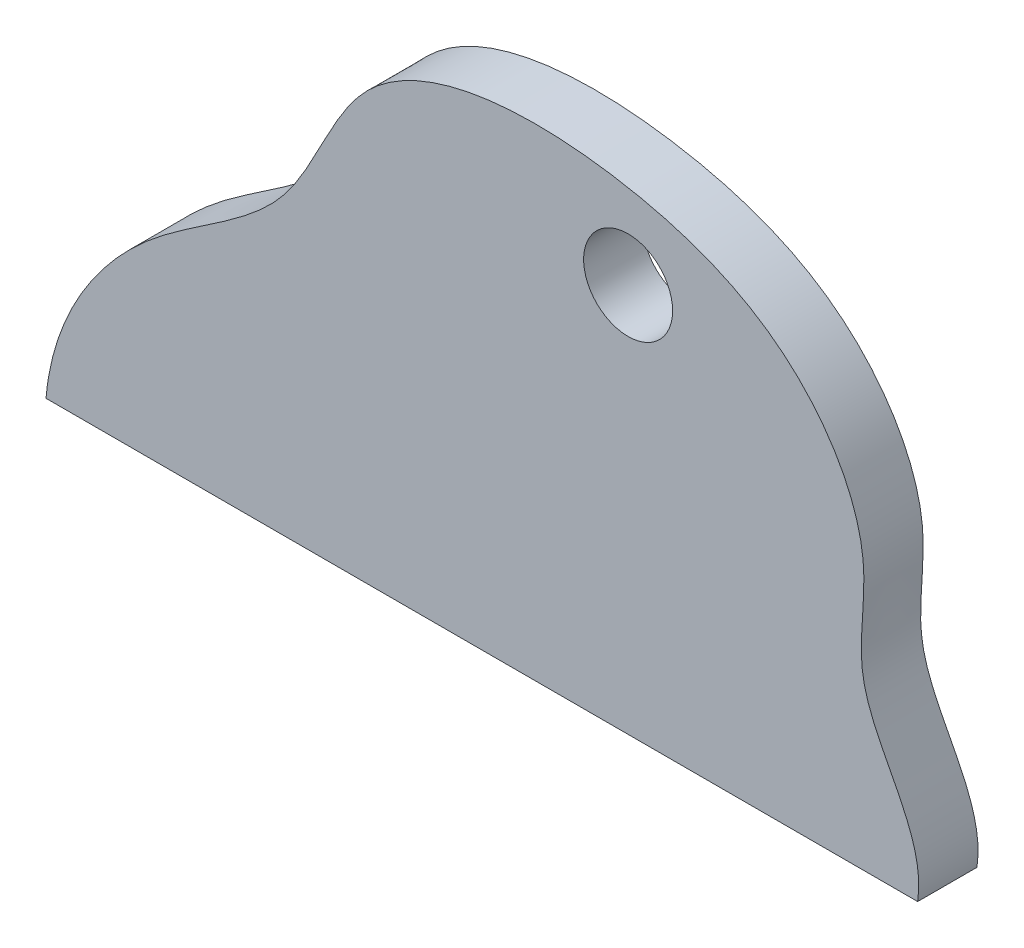
ISO-10303-21;
HEADER;
FILE_DESCRIPTION(('STEP AP214'),'2;1');
FILE_NAME('part.step','',(''),(''),'','','');
FILE_SCHEMA(('AUTOMOTIVE_DESIGN { 1 0 10303 214 1 1 1 1 }'));
ENDSEC;
DATA;
#1=APPLICATION_CONTEXT('core data for automotive mechanical design processes');
#2=APPLICATION_PROTOCOL_DEFINITION('international standard','automotive_design',2000,#1);
#3=PRODUCT_CONTEXT('',#1,'mechanical');
#4=PRODUCT('Part','Part','',(#3));
#5=PRODUCT_RELATED_PRODUCT_CATEGORY('part','',(#4));
#6=PRODUCT_DEFINITION_FORMATION('','',#4);
#7=PRODUCT_DEFINITION_CONTEXT('part definition',#1,'design');
#8=PRODUCT_DEFINITION('design','',#6,#7);
#9=PRODUCT_DEFINITION_SHAPE('','',#8);
#10=(LENGTH_UNIT() NAMED_UNIT(*) SI_UNIT(.MILLI.,.METRE.));
#11=(NAMED_UNIT(*) PLANE_ANGLE_UNIT() SI_UNIT($,.RADIAN.));
#12=(NAMED_UNIT(*) SI_UNIT($,.STERADIAN.) SOLID_ANGLE_UNIT());
#13=UNCERTAINTY_MEASURE_WITH_UNIT(LENGTH_MEASURE(1.E-05),#10,'distance_accuracy_value','');
#14=(GEOMETRIC_REPRESENTATION_CONTEXT(3) GLOBAL_UNCERTAINTY_ASSIGNED_CONTEXT((#13)) GLOBAL_UNIT_ASSIGNED_CONTEXT((#10,
#11,#12)) REPRESENTATION_CONTEXT('',''));
#15=CARTESIAN_POINT('',(0.,0.,0.));
#16=DIRECTION('',(0.,0.,1.));
#17=DIRECTION('',(1.,0.,0.));
#18=AXIS2_PLACEMENT_3D('',#15,#16,#17);
#19=CARTESIAN_POINT('',(448.777806783927,58.388253682406,3.73350148502297));
#20=DIRECTION('',(0.,0.,1.));
#21=DIRECTION('',(1.,0.,0.));
#22=AXIS2_PLACEMENT_3D('',#19,#20,#21);
#23=PLANE('',#22);
#24=CARTESIAN_POINT('',(454.750929555263,53.415813648006,3.73350148502297));
#25=DIRECTION('',(0.,0.,1.));
#26=DIRECTION('',(1.,0.,0.));
#27=AXIS2_PLACEMENT_3D('',#24,#25,#26);
#28=CIRCLE('',#27,2.38125);
#29=CARTESIAN_POINT('',(457.132179555263,53.415813648006,3.73350148502297));
#30=VERTEX_POINT('',#29);
#31=EDGE_CURVE('E75',#30,#30,#28,.T.);
#32=ORIENTED_EDGE('',*,*,#31,.F.);
#33=EDGE_LOOP('',(#32));
#34=FACE_BOUND('',#33,.T.);
#35=CARTESIAN_POINT('',(470.251737266378,32.5866032861945,3.73350148502297));
#36=CARTESIAN_POINT('',(470.750883981836,35.9022041792691,3.73350148502297));
#37=CARTESIAN_POINT('',(466.253912236021,39.9371943128726,3.73350148502297));
#38=CARTESIAN_POINT('',(468.102198779636,47.5502844614912,3.73350148502297));
#39=CARTESIAN_POINT('',(463.984519322268,54.9871581452452,3.73350148502297));
#40=CARTESIAN_POINT('',(453.915067328337,59.0936322057848,3.73350148502297));
#41=CARTESIAN_POINT('',(440.359759995239,58.4584966180975,3.73350148502297));
#42=CARTESIAN_POINT('',(437.047298305273,47.3163135006459,3.73350148502297));
#43=CARTESIAN_POINT('',(427.8943832988,43.0056334636702,3.73350148502297));
#44=CARTESIAN_POINT('',(423.949662501625,36.6974160406366,3.73350148502297));
#45=CARTESIAN_POINT('',(423.587847386041,32.5866032861945,3.73350148502297));
#46=B_SPLINE_CURVE_WITH_KNOTS('',3,(#35,#36,#37,#38,#39,#40,#41,#42,#43,#44,#45),.UNSPECIFIED.,
.F.,.F.,(4,1,1,1,1,1,1,1,4),(0.,0.123490607000142,0.193733585487914,0.290834879771525,
0.427925692940669,0.618703504281154,0.723847358274503,0.84053133361642,1.),.UNSPECIFIED.);
#47=CARTESIAN_POINT('',(470.251737266378,32.5866032861945,3.73350148502297));
#48=VERTEX_POINT('',#47);
#49=CARTESIAN_POINT('',(423.587847386041,32.5866032861945,3.73350148502297));
#50=VERTEX_POINT('',#49);
#51=EDGE_CURVE('E67',#48,#50,#46,.T.);
#52=ORIENTED_EDGE('',*,*,#51,.T.);
#53=DIRECTION('',(1.,0.,0.));
#54=VECTOR('',#53,1.);
#55=CARTESIAN_POINT('',(423.587847386041,32.5866032861945,3.73350148502297));
#56=LINE('',#55,#54);
#57=EDGE_CURVE('E52',#50,#48,#56,.T.);
#58=ORIENTED_EDGE('',*,*,#57,.T.);
#59=EDGE_LOOP('',(#52,#58));
#60=FACE_BOUND('',#59,.T.);
#61=ADVANCED_FACE('F35',(#34,#60),#23,.T.);
#62=CARTESIAN_POINT('',(448.777806783927,58.388253682406,0.558501485380882));
#63=DIRECTION('',(0.,0.,1.));
#64=DIRECTION('',(1.,0.,0.));
#65=AXIS2_PLACEMENT_3D('',#62,#63,#64);
#66=PLANE('',#65);
#67=CARTESIAN_POINT('',(454.750929555263,53.415813648006,0.558501485380882));
#68=DIRECTION('',(0.,0.,1.));
#69=DIRECTION('',(1.,0.,0.));
#70=AXIS2_PLACEMENT_3D('',#67,#68,#69);
#71=CIRCLE('',#70,2.38125);
#72=CARTESIAN_POINT('',(457.132179555263,53.415813648006,0.558501485380882));
#73=VERTEX_POINT('',#72);
#74=EDGE_CURVE('E72',#73,#73,#71,.T.);
#75=ORIENTED_EDGE('',*,*,#74,.T.);
#76=EDGE_LOOP('',(#75));
#77=FACE_BOUND('',#76,.T.);
#78=CARTESIAN_POINT('',(470.251737266378,32.5866032861945,0.558501485380882));
#79=CARTESIAN_POINT('',(470.750883981836,35.9022041792691,0.558501485380882));
#80=CARTESIAN_POINT('',(466.253912236021,39.9371943128726,0.558501485380882));
#81=CARTESIAN_POINT('',(468.102198779636,47.5502844614912,0.558501485380882));
#82=CARTESIAN_POINT('',(463.984519322268,54.9871581452452,0.558501485380882));
#83=CARTESIAN_POINT('',(453.915067328337,59.0936322057848,0.558501485380882));
#84=CARTESIAN_POINT('',(440.359759995239,58.4584966180975,0.558501485380882));
#85=CARTESIAN_POINT('',(437.047298305273,47.3163135006459,0.558501485380882));
#86=CARTESIAN_POINT('',(427.8943832988,43.0056334636702,0.558501485380882));
#87=CARTESIAN_POINT('',(423.949662501625,36.6974160406366,0.558501485380882));
#88=CARTESIAN_POINT('',(423.587847386041,32.5866032861945,0.558501485380882));
#89=B_SPLINE_CURVE_WITH_KNOTS('',3,(#78,#79,#80,#81,#82,#83,#84,#85,#86,#87,#88),.UNSPECIFIED.,
.F.,.F.,(4,1,1,1,1,1,1,1,4),(0.,0.123490607000142,0.193733585487914,0.290834879771525,
0.427925692940669,0.618703504281154,0.723847358274503,0.84053133361642,1.),.UNSPECIFIED.);
#90=CARTESIAN_POINT('',(470.251737266378,32.5866032861945,0.558501485380882));
#91=VERTEX_POINT('',#90);
#92=CARTESIAN_POINT('',(423.587847386041,32.5866032861945,0.558501485380882));
#93=VERTEX_POINT('',#92);
#94=EDGE_CURVE('E68',#91,#93,#89,.T.);
#95=ORIENTED_EDGE('',*,*,#94,.F.);
#96=DIRECTION('',(1.,0.,0.));
#97=VECTOR('',#96,1.);
#98=CARTESIAN_POINT('',(423.587847386041,32.5866032861945,0.558501485380882));
#99=LINE('',#98,#97);
#100=EDGE_CURVE('E60',#93,#91,#99,.T.);
#101=ORIENTED_EDGE('',*,*,#100,.F.);
#102=EDGE_LOOP('',(#95,#101));
#103=FACE_BOUND('',#102,.T.);
#104=ADVANCED_FACE('F71',(#77,#103),#66,.F.);
#105=DIRECTION('',(0.,0.,-1.));
#106=VECTOR('',#105,1.);
#107=SURFACE_OF_LINEAR_EXTRUSION('',#46,#106);
#108=ORIENTED_EDGE('',*,*,#94,.T.);
#109=DIRECTION('',(0.,0.,-1.));
#110=VECTOR('',#109,1.);
#111=CARTESIAN_POINT('',(423.587847386041,32.5866032861945,3.73350148502297));
#112=LINE('',#111,#110);
#113=EDGE_CURVE('E11',#50,#93,#112,.T.);
#114=ORIENTED_EDGE('',*,*,#113,.F.);
#115=ORIENTED_EDGE('',*,*,#51,.F.);
#116=DIRECTION('',(0.,0.,-1.));
#117=VECTOR('',#116,1.);
#118=CARTESIAN_POINT('',(470.251737266378,32.5866032861945,3.73350148502297));
#119=LINE('',#118,#117);
#120=EDGE_CURVE('E45',#48,#91,#119,.T.);
#121=ORIENTED_EDGE('',*,*,#120,.T.);
#122=EDGE_LOOP('',(#108,#114,#115,#121));
#123=FACE_BOUND('',#122,.T.);
#124=ADVANCED_FACE('F37',(#123),#107,.F.);
#125=CARTESIAN_POINT('',(423.587847386041,32.5866032861945,3.73350148502297));
#126=DIRECTION('',(0.,1.,0.));
#127=DIRECTION('',(0.,0.,1.));
#128=AXIS2_PLACEMENT_3D('',#125,#126,#127);
#129=PLANE('',#128);
#130=ORIENTED_EDGE('',*,*,#100,.T.);
#131=ORIENTED_EDGE('',*,*,#120,.F.);
#132=ORIENTED_EDGE('',*,*,#57,.F.);
#133=ORIENTED_EDGE('',*,*,#113,.T.);
#134=EDGE_LOOP('',(#130,#131,#132,#133));
#135=FACE_BOUND('',#134,.T.);
#136=ADVANCED_FACE('F63',(#135),#129,.F.);
#137=CARTESIAN_POINT('',(454.750929555263,53.415813648006,0.558501485380882));
#138=DIRECTION('',(0.,0.,1.));
#139=DIRECTION('',(1.,0.,0.));
#140=AXIS2_PLACEMENT_3D('',#137,#138,#139);
#141=CYLINDRICAL_SURFACE('',#140,2.38125);
#142=CARTESIAN_POINT('',(457.132179555263,53.415813648006,0.558501485380882));
#143=CARTESIAN_POINT('',(457.132179555263,53.415813648006,0.59157440204382));
#144=CARTESIAN_POINT('',(457.132179555263,53.415813648006,0.624647318706758));
#145=CARTESIAN_POINT('',(457.132179555263,53.415813648006,0.690793152032635));
#146=CARTESIAN_POINT('',(457.132179555263,53.415813648006,0.723866068695574));
#147=CARTESIAN_POINT('',(457.132179555263,53.415813648006,0.790011902021451));
#148=CARTESIAN_POINT('',(457.132179555263,53.415813648006,0.823084818684389));
#149=CARTESIAN_POINT('',(457.132179555263,53.415813648006,0.889230652010266));
#150=CARTESIAN_POINT('',(457.132179555263,53.415813648006,0.922303568673204));
#151=CARTESIAN_POINT('',(457.132179555263,53.415813648006,0.988449401999081));
#152=CARTESIAN_POINT('',(457.132179555263,53.415813648006,1.02152231866202));
#153=CARTESIAN_POINT('',(457.132179555263,53.415813648006,1.0876681519879));
#154=CARTESIAN_POINT('',(457.132179555263,53.415813648006,1.12074106865084));
#155=CARTESIAN_POINT('',(457.132179555263,53.415813648006,1.18688690197671));
#156=CARTESIAN_POINT('',(457.132179555263,53.415813648006,1.21995981863965));
#157=CARTESIAN_POINT('',(457.132179555263,53.415813648006,1.28610565196553));
#158=CARTESIAN_POINT('',(457.132179555263,53.415813648006,1.31917856862847));
#159=CARTESIAN_POINT('',(457.132179555263,53.415813648006,1.38532440195434));
#160=CARTESIAN_POINT('',(457.132179555263,53.415813648006,1.41839731861728));
#161=CARTESIAN_POINT('',(457.132179555263,53.415813648006,1.48454315194316));
#162=CARTESIAN_POINT('',(457.132179555263,53.415813648006,1.5176160686061));
#163=CARTESIAN_POINT('',(457.132179555263,53.415813648006,1.58376190193197));
#164=CARTESIAN_POINT('',(457.132179555263,53.415813648006,1.61683481859491));
#165=CARTESIAN_POINT('',(457.132179555263,53.415813648006,1.68298065192079));
#166=CARTESIAN_POINT('',(457.132179555263,53.415813648006,1.71605356858373));
#167=CARTESIAN_POINT('',(457.132179555263,53.415813648006,1.7821994019096));
#168=CARTESIAN_POINT('',(457.132179555263,53.415813648006,1.81527231857254));
#169=CARTESIAN_POINT('',(457.132179555263,53.415813648006,1.88141815189842));
#170=CARTESIAN_POINT('',(457.132179555263,53.415813648006,1.91449106856136));
#171=CARTESIAN_POINT('',(457.132179555263,53.415813648006,1.98063690188723));
#172=CARTESIAN_POINT('',(457.132179555263,53.415813648006,2.01370981855017));
#173=CARTESIAN_POINT('',(457.132179555263,53.415813648006,2.07985565187605));
#174=CARTESIAN_POINT('',(457.132179555263,53.415813648006,2.11292856853899));
#175=CARTESIAN_POINT('',(457.132179555263,53.415813648006,2.17907440186487));
#176=CARTESIAN_POINT('',(457.132179555263,53.415813648006,2.2121473185278));
#177=CARTESIAN_POINT('',(457.132179555263,53.415813648006,2.27829315185368));
#178=CARTESIAN_POINT('',(457.132179555263,53.415813648006,2.31136606851662));
#179=CARTESIAN_POINT('',(457.132179555263,53.415813648006,2.3775119018425));
#180=CARTESIAN_POINT('',(457.132179555263,53.415813648006,2.41058481850543));
#181=CARTESIAN_POINT('',(457.132179555263,53.415813648006,2.47673065183131));
#182=CARTESIAN_POINT('',(457.132179555263,53.415813648006,2.50980356849425));
#183=CARTESIAN_POINT('',(457.132179555263,53.415813648006,2.57594940182013));
#184=CARTESIAN_POINT('',(457.132179555263,53.415813648006,2.60902231848306));
#185=CARTESIAN_POINT('',(457.132179555263,53.415813648006,2.67516815180894));
#186=CARTESIAN_POINT('',(457.132179555263,53.415813648006,2.70824106847188));
#187=CARTESIAN_POINT('',(457.132179555263,53.415813648006,2.77438690179776));
#188=CARTESIAN_POINT('',(457.132179555263,53.415813648006,2.8074598184607));
#189=CARTESIAN_POINT('',(457.132179555263,53.415813648006,2.87360565178657));
#190=CARTESIAN_POINT('',(457.132179555263,53.415813648006,2.90667856844951));
#191=CARTESIAN_POINT('',(457.132179555263,53.415813648006,2.97282440177539));
#192=CARTESIAN_POINT('',(457.132179555263,53.415813648006,3.00589731843833));
#193=CARTESIAN_POINT('',(457.132179555263,53.415813648006,3.0720431517642));
#194=CARTESIAN_POINT('',(457.132179555263,53.415813648006,3.10511606842714));
#195=CARTESIAN_POINT('',(457.132179555263,53.415813648006,3.17126190175302));
#196=CARTESIAN_POINT('',(457.132179555263,53.415813648006,3.20433481841596));
#197=CARTESIAN_POINT('',(457.132179555263,53.415813648006,3.27048065174183));
#198=CARTESIAN_POINT('',(457.132179555263,53.415813648006,3.30355356840477));
#199=CARTESIAN_POINT('',(457.132179555263,53.415813648006,3.36969940173065));
#200=CARTESIAN_POINT('',(457.132179555263,53.415813648006,3.40277231839359));
#201=CARTESIAN_POINT('',(457.132179555263,53.415813648006,3.46891815171946));
#202=CARTESIAN_POINT('',(457.132179555263,53.415813648006,3.5019910683824));
#203=CARTESIAN_POINT('',(457.132179555263,53.415813648006,3.56813690170828));
#204=CARTESIAN_POINT('',(457.132179555263,53.415813648006,3.60120981837122));
#205=CARTESIAN_POINT('',(457.132179555263,53.415813648006,3.6673556516971));
#206=CARTESIAN_POINT('',(457.132179555263,53.415813648006,3.70042856836003));
#207=CARTESIAN_POINT('',(457.132179555263,53.415813648006,3.73350148502297));
#208=B_SPLINE_CURVE_WITH_KNOTS('',3,(#142,#143,#144,#145,#146,#147,#148,#149,#150,#151,#152,
#153,#154,#155,#156,#157,#158,#159,#160,#161,#162,#163,#164,#165,#166,#167,#168,#169,#170,#171,
#172,#173,#174,#175,#176,#177,#178,#179,#180,#181,#182,#183,#184,#185,#186,#187,#188,#189,#190,
#191,#192,#193,#194,#195,#196,#197,#198,#199,#200,#201,#202,#203,#204,#205,#206,#207),
.UNSPECIFIED.,.F.,.F.,(4,2,2,2,2,2,2,2,2,2,2,2,2,2,2,2,2,2,2,2,2,2,2,2,2,2,2,2,2,2,2,2,4),(0.,
0.0992187499888153,0.198437499977631,0.297656249966446,0.396874999955261,0.496093749944076,
0.595312499932892,0.694531249921707,0.793749999910523,0.892968749899338,0.992187499888153,
1.09140624987697,1.19062499986578,1.2898437498546,1.38906249984341,1.48828124983223,
1.58749999982105,1.68671874980986,1.78593749979868,1.88515624978749,1.98437499977631,
2.08359374976512,2.18281249975394,2.28203124974275,2.38124999973157,2.48046874972038,
2.5796874997092,2.67890624969801,2.77812499968683,2.87734374967564,2.97656249966446,
3.07578124965328,3.17499999964209),.UNSPECIFIED.);
#209=EDGE_CURVE('BSEAM93',#73,#30,#208,.T.);
#210=ORIENTED_EDGE('',*,*,#74,.F.);
#211=ORIENTED_EDGE('',*,*,#31,.T.);
#212=ORIENTED_EDGE('',*,*,#209,.T.);
#213=ORIENTED_EDGE('',*,*,#209,.F.);
#214=EDGE_LOOP('',(#210,#212,#211,#213));
#215=FACE_BOUND('',#214,.T.);
#216=ADVANCED_FACE('F93',(#215),#141,.F.);
#217=CLOSED_SHELL('',(#61,#104,#124,#136,#216));
#218=MANIFOLD_SOLID_BREP('B2',#217);
#219=ADVANCED_BREP_SHAPE_REPRESENTATION('',(#18,#218),#14);
#220=SHAPE_DEFINITION_REPRESENTATION(#9,#219);
ENDSEC;
END-ISO-10303-21;
